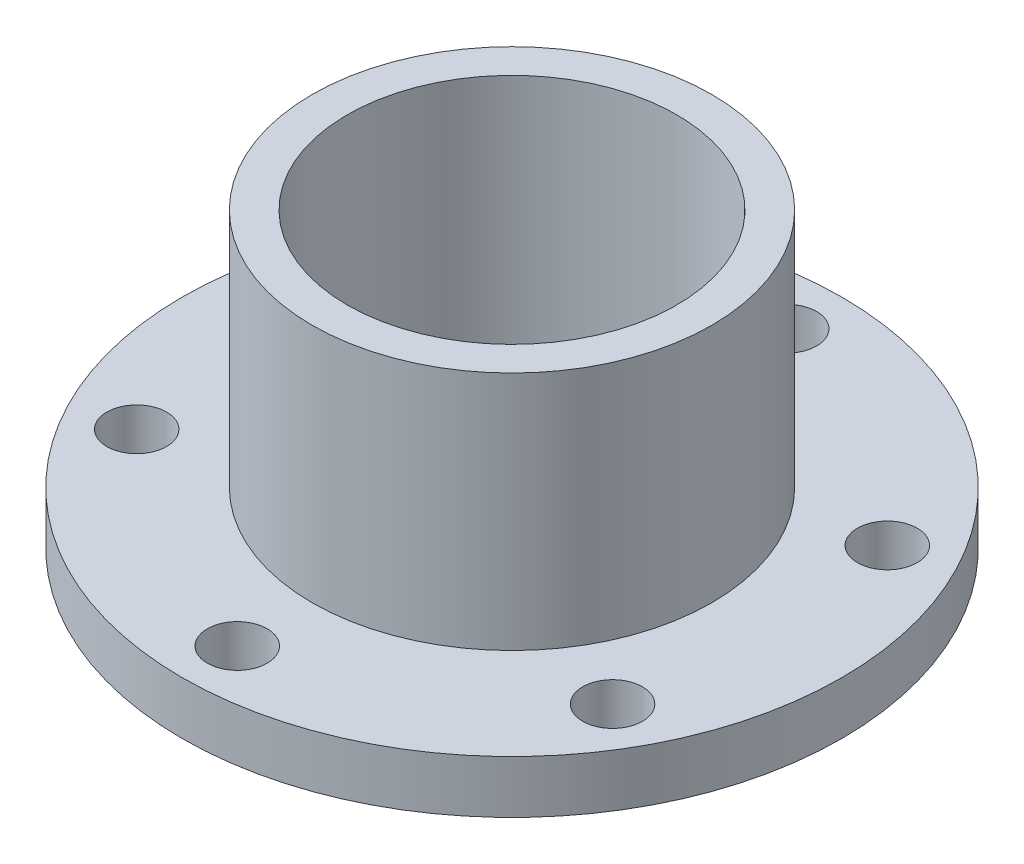
ISO-10303-21;
HEADER;
FILE_DESCRIPTION(('STEP AP214'),'2;1');
FILE_NAME('part.step','',(''),(''),'','','');
FILE_SCHEMA(('AUTOMOTIVE_DESIGN { 1 0 10303 214 1 1 1 1 }'));
ENDSEC;
DATA;
#1=APPLICATION_CONTEXT('core data for automotive mechanical design processes');
#2=APPLICATION_PROTOCOL_DEFINITION('international standard','automotive_design',2000,#1);
#3=PRODUCT_CONTEXT('',#1,'mechanical');
#4=PRODUCT('Part','Part','',(#3));
#5=PRODUCT_RELATED_PRODUCT_CATEGORY('part','',(#4));
#6=PRODUCT_DEFINITION_FORMATION('','',#4);
#7=PRODUCT_DEFINITION_CONTEXT('part definition',#1,'design');
#8=PRODUCT_DEFINITION('design','',#6,#7);
#9=PRODUCT_DEFINITION_SHAPE('','',#8);
#10=(LENGTH_UNIT() NAMED_UNIT(*) SI_UNIT(.MILLI.,.METRE.));
#11=(NAMED_UNIT(*) PLANE_ANGLE_UNIT() SI_UNIT($,.RADIAN.));
#12=(NAMED_UNIT(*) SI_UNIT($,.STERADIAN.) SOLID_ANGLE_UNIT());
#13=UNCERTAINTY_MEASURE_WITH_UNIT(LENGTH_MEASURE(1.E-05),#10,'distance_accuracy_value','');
#14=(GEOMETRIC_REPRESENTATION_CONTEXT(3) GLOBAL_UNCERTAINTY_ASSIGNED_CONTEXT((#13)) GLOBAL_UNIT_ASSIGNED_CONTEXT((#10,
#11,#12)) REPRESENTATION_CONTEXT('',''));
#15=CARTESIAN_POINT('',(0.,0.,0.));
#16=DIRECTION('',(0.,0.,1.));
#17=DIRECTION('',(1.,0.,0.));
#18=AXIS2_PLACEMENT_3D('',#15,#16,#17);
#19=CARTESIAN_POINT('',(0.,0.,0.));
#20=DIRECTION('',(0.,-1.,0.));
#21=DIRECTION('',(0.,0.,-1.));
#22=AXIS2_PLACEMENT_3D('',#19,#20,#21);
#23=CYLINDRICAL_SURFACE('',#22,17.3228);
#24=CARTESIAN_POINT('',(0.,25.4,0.));
#25=DIRECTION('',(0.,-1.,0.));
#26=DIRECTION('',(0.,0.,-1.));
#27=AXIS2_PLACEMENT_3D('',#24,#25,#26);
#28=CIRCLE('',#27,17.3228);
#29=CARTESIAN_POINT('',(0.,25.4,-17.3228));
#30=VERTEX_POINT('',#29);
#31=EDGE_CURVE('E18',#30,#30,#28,.F.);
#32=ORIENTED_EDGE('',*,*,#31,.F.);
#33=EDGE_LOOP('',(#32));
#34=FACE_BOUND('',#33,.T.);
#35=CARTESIAN_POINT('',(0.,4.572,0.));
#36=DIRECTION('',(0.,-1.,0.));
#37=DIRECTION('',(0.,0.,-1.));
#38=AXIS2_PLACEMENT_3D('',#35,#36,#37);
#39=CIRCLE('',#38,17.3228);
#40=CARTESIAN_POINT('',(0.,4.572,-17.3228));
#41=VERTEX_POINT('',#40);
#42=EDGE_CURVE('E70',#41,#41,#39,.T.);
#43=ORIENTED_EDGE('',*,*,#42,.F.);
#44=EDGE_LOOP('',(#43));
#45=FACE_BOUND('',#44,.T.);
#46=ADVANCED_FACE('F15',(#34,#45),#23,.T.);
#47=CARTESIAN_POINT('',(0.,25.4,0.));
#48=DIRECTION('',(0.,1.,0.));
#49=DIRECTION('',(0.,0.,1.));
#50=AXIS2_PLACEMENT_3D('',#47,#48,#49);
#51=PLANE('',#50);
#52=ORIENTED_EDGE('',*,*,#31,.T.);
#53=EDGE_LOOP('',(#52));
#54=FACE_BOUND('',#53,.T.);
#55=CARTESIAN_POINT('',(0.,25.4,0.));
#56=DIRECTION('',(0.,1.,0.));
#57=DIRECTION('',(0.,0.,1.));
#58=AXIS2_PLACEMENT_3D('',#55,#56,#57);
#59=CIRCLE('',#58,14.28115);
#60=CARTESIAN_POINT('',(0.,25.4,14.28115));
#61=VERTEX_POINT('',#60);
#62=EDGE_CURVE('E50',#61,#61,#59,.F.);
#63=ORIENTED_EDGE('',*,*,#62,.T.);
#64=EDGE_LOOP('',(#63));
#65=FACE_BOUND('',#64,.T.);
#66=ADVANCED_FACE('F77',(#54,#65),#51,.T.);
#67=CARTESIAN_POINT('',(28.575,4.572,0.));
#68=DIRECTION('',(0.,1.,0.));
#69=DIRECTION('',(0.,0.,1.));
#70=AXIS2_PLACEMENT_3D('',#67,#68,#69);
#71=PLANE('',#70);
#72=CARTESIAN_POINT('',(0.,4.572,0.));
#73=DIRECTION('',(0.,-1.,0.));
#74=DIRECTION('',(0.,0.,-1.));
#75=AXIS2_PLACEMENT_3D('',#72,#73,#74);
#76=CIRCLE('',#75,28.575);
#77=CARTESIAN_POINT('',(0.,4.572,-28.575));
#78=VERTEX_POINT('',#77);
#79=EDGE_CURVE('E47',#78,#78,#76,.T.);
#80=ORIENTED_EDGE('',*,*,#79,.F.);
#81=EDGE_LOOP('',(#80));
#82=FACE_BOUND('',#81,.T.);
#83=ORIENTED_EDGE('',*,*,#42,.T.);
#84=EDGE_LOOP('',(#83));
#85=FACE_BOUND('',#84,.T.);
#86=CARTESIAN_POINT('',(0.,4.572,23.8125));
#87=DIRECTION('',(0.,1.,0.));
#88=DIRECTION('',(0.,0.,1.));
#89=AXIS2_PLACEMENT_3D('',#86,#87,#88);
#90=CIRCLE('',#89,2.5908);
#91=CARTESIAN_POINT('',(0.,4.572,26.4033));
#92=VERTEX_POINT('',#91);
#93=EDGE_CURVE('E53',#92,#92,#90,.F.);
#94=ORIENTED_EDGE('',*,*,#93,.T.);
#95=EDGE_LOOP('',(#94));
#96=FACE_BOUND('',#95,.T.);
#97=CARTESIAN_POINT('',(-20.622229927617,4.572,11.90625));
#98=DIRECTION('',(0.,1.,0.));
#99=DIRECTION('',(0.,0.,1.));
#100=AXIS2_PLACEMENT_3D('',#97,#98,#99);
#101=CIRCLE('',#100,2.5908);
#102=CARTESIAN_POINT('',(-20.622229927617,4.572,14.49705));
#103=VERTEX_POINT('',#102);
#104=EDGE_CURVE('E56',#103,#103,#101,.F.);
#105=ORIENTED_EDGE('',*,*,#104,.T.);
#106=EDGE_LOOP('',(#105));
#107=FACE_BOUND('',#106,.T.);
#108=CARTESIAN_POINT('',(-20.6222299276169,4.572,-11.9062500000001));
#109=DIRECTION('',(0.,1.,0.));
#110=DIRECTION('',(0.,0.,1.));
#111=AXIS2_PLACEMENT_3D('',#108,#109,#110);
#112=CIRCLE('',#111,2.5908);
#113=CARTESIAN_POINT('',(-20.6222299276169,4.572,-9.3154500000001));
#114=VERTEX_POINT('',#113);
#115=EDGE_CURVE('E59',#114,#114,#112,.F.);
#116=ORIENTED_EDGE('',*,*,#115,.T.);
#117=EDGE_LOOP('',(#116));
#118=FACE_BOUND('',#117,.T.);
#119=CARTESIAN_POINT('',(1.66281798762404E-13,4.572,-23.8125));
#120=DIRECTION('',(0.,1.,0.));
#121=DIRECTION('',(0.,0.,1.));
#122=AXIS2_PLACEMENT_3D('',#119,#120,#121);
#123=CIRCLE('',#122,2.5908);
#124=CARTESIAN_POINT('',(1.66281798762404E-13,4.572,-21.2217));
#125=VERTEX_POINT('',#124);
#126=EDGE_CURVE('E62',#125,#125,#123,.F.);
#127=ORIENTED_EDGE('',*,*,#126,.T.);
#128=EDGE_LOOP('',(#127));
#129=FACE_BOUND('',#128,.T.);
#130=CARTESIAN_POINT('',(20.6222299276171,4.572,-11.9062499999998));
#131=DIRECTION('',(0.,1.,0.));
#132=DIRECTION('',(0.,0.,1.));
#133=AXIS2_PLACEMENT_3D('',#130,#131,#132);
#134=CIRCLE('',#133,2.5908);
#135=CARTESIAN_POINT('',(20.6222299276171,4.572,-9.31544999999981));
#136=VERTEX_POINT('',#135);
#137=EDGE_CURVE('E65',#136,#136,#134,.F.);
#138=ORIENTED_EDGE('',*,*,#137,.T.);
#139=EDGE_LOOP('',(#138));
#140=FACE_BOUND('',#139,.T.);
#141=CARTESIAN_POINT('',(20.6222299276168,4.572,11.9062500000002));
#142=DIRECTION('',(0.,1.,0.));
#143=DIRECTION('',(0.,0.,1.));
#144=AXIS2_PLACEMENT_3D('',#141,#142,#143);
#145=CIRCLE('',#144,2.5908);
#146=CARTESIAN_POINT('',(20.6222299276168,4.572,14.4970500000002));
#147=VERTEX_POINT('',#146);
#148=EDGE_CURVE('E68',#147,#147,#145,.F.);
#149=ORIENTED_EDGE('',*,*,#148,.T.);
#150=EDGE_LOOP('',(#149));
#151=FACE_BOUND('',#150,.T.);
#152=ADVANCED_FACE('F86',(#82,#85,#96,#107,#118,#129,#140,#151),#71,.T.);
#153=CARTESIAN_POINT('',(20.6222299276168,0.,11.9062500000002));
#154=DIRECTION('',(0.,1.,0.));
#155=DIRECTION('',(0.,0.,1.));
#156=AXIS2_PLACEMENT_3D('',#153,#154,#155);
#157=CYLINDRICAL_SURFACE('',#156,2.5908);
#158=ORIENTED_EDGE('',*,*,#148,.F.);
#159=EDGE_LOOP('',(#158));
#160=FACE_BOUND('',#159,.T.);
#161=CARTESIAN_POINT('',(20.6222299276168,0.,11.9062500000002));
#162=DIRECTION('',(0.,1.,0.));
#163=DIRECTION('',(0.,0.,1.));
#164=AXIS2_PLACEMENT_3D('',#161,#162,#163);
#165=CIRCLE('',#164,2.5908);
#166=CARTESIAN_POINT('',(20.6222299276168,0.,14.4970500000002));
#167=VERTEX_POINT('',#166);
#168=EDGE_CURVE('E44',#167,#167,#165,.T.);
#169=ORIENTED_EDGE('',*,*,#168,.F.);
#170=EDGE_LOOP('',(#169));
#171=FACE_BOUND('',#170,.T.);
#172=ADVANCED_FACE('F121',(#160,#171),#157,.F.);
#173=CARTESIAN_POINT('',(20.6222299276171,0.,-11.9062499999998));
#174=DIRECTION('',(0.,1.,0.));
#175=DIRECTION('',(0.,0.,1.));
#176=AXIS2_PLACEMENT_3D('',#173,#174,#175);
#177=CYLINDRICAL_SURFACE('',#176,2.5908);
#178=ORIENTED_EDGE('',*,*,#137,.F.);
#179=EDGE_LOOP('',(#178));
#180=FACE_BOUND('',#179,.T.);
#181=CARTESIAN_POINT('',(20.6222299276171,0.,-11.9062499999998));
#182=DIRECTION('',(0.,1.,0.));
#183=DIRECTION('',(0.,0.,1.));
#184=AXIS2_PLACEMENT_3D('',#181,#182,#183);
#185=CIRCLE('',#184,2.5908);
#186=CARTESIAN_POINT('',(20.6222299276171,0.,-9.31544999999981));
#187=VERTEX_POINT('',#186);
#188=EDGE_CURVE('E41',#187,#187,#185,.T.);
#189=ORIENTED_EDGE('',*,*,#188,.F.);
#190=EDGE_LOOP('',(#189));
#191=FACE_BOUND('',#190,.T.);
#192=ADVANCED_FACE('F117',(#180,#191),#177,.F.);
#193=CARTESIAN_POINT('',(1.66281798762404E-13,0.,-23.8125));
#194=DIRECTION('',(0.,1.,0.));
#195=DIRECTION('',(0.,0.,1.));
#196=AXIS2_PLACEMENT_3D('',#193,#194,#195);
#197=CYLINDRICAL_SURFACE('',#196,2.5908);
#198=ORIENTED_EDGE('',*,*,#126,.F.);
#199=EDGE_LOOP('',(#198));
#200=FACE_BOUND('',#199,.T.);
#201=CARTESIAN_POINT('',(1.66281798762404E-13,0.,-23.8125));
#202=DIRECTION('',(0.,1.,0.));
#203=DIRECTION('',(0.,0.,1.));
#204=AXIS2_PLACEMENT_3D('',#201,#202,#203);
#205=CIRCLE('',#204,2.5908);
#206=CARTESIAN_POINT('',(1.66281798762404E-13,0.,-21.2217));
#207=VERTEX_POINT('',#206);
#208=EDGE_CURVE('E38',#207,#207,#205,.T.);
#209=ORIENTED_EDGE('',*,*,#208,.F.);
#210=EDGE_LOOP('',(#209));
#211=FACE_BOUND('',#210,.T.);
#212=ADVANCED_FACE('F113',(#200,#211),#197,.F.);
#213=CARTESIAN_POINT('',(-20.6222299276169,0.,-11.9062500000001));
#214=DIRECTION('',(0.,1.,0.));
#215=DIRECTION('',(0.,0.,1.));
#216=AXIS2_PLACEMENT_3D('',#213,#214,#215);
#217=CYLINDRICAL_SURFACE('',#216,2.5908);
#218=ORIENTED_EDGE('',*,*,#115,.F.);
#219=EDGE_LOOP('',(#218));
#220=FACE_BOUND('',#219,.T.);
#221=CARTESIAN_POINT('',(-20.6222299276169,0.,-11.9062500000001));
#222=DIRECTION('',(0.,1.,0.));
#223=DIRECTION('',(0.,0.,1.));
#224=AXIS2_PLACEMENT_3D('',#221,#222,#223);
#225=CIRCLE('',#224,2.5908);
#226=CARTESIAN_POINT('',(-20.6222299276169,0.,-9.3154500000001));
#227=VERTEX_POINT('',#226);
#228=EDGE_CURVE('E35',#227,#227,#225,.T.);
#229=ORIENTED_EDGE('',*,*,#228,.F.);
#230=EDGE_LOOP('',(#229));
#231=FACE_BOUND('',#230,.T.);
#232=ADVANCED_FACE('F109',(#220,#231),#217,.F.);
#233=CARTESIAN_POINT('',(-20.622229927617,0.,11.90625));
#234=DIRECTION('',(0.,1.,0.));
#235=DIRECTION('',(0.,0.,1.));
#236=AXIS2_PLACEMENT_3D('',#233,#234,#235);
#237=CYLINDRICAL_SURFACE('',#236,2.5908);
#238=ORIENTED_EDGE('',*,*,#104,.F.);
#239=EDGE_LOOP('',(#238));
#240=FACE_BOUND('',#239,.T.);
#241=CARTESIAN_POINT('',(-20.622229927617,0.,11.90625));
#242=DIRECTION('',(0.,1.,0.));
#243=DIRECTION('',(0.,0.,1.));
#244=AXIS2_PLACEMENT_3D('',#241,#242,#243);
#245=CIRCLE('',#244,2.5908);
#246=CARTESIAN_POINT('',(-20.622229927617,0.,14.49705));
#247=VERTEX_POINT('',#246);
#248=EDGE_CURVE('E32',#247,#247,#245,.T.);
#249=ORIENTED_EDGE('',*,*,#248,.F.);
#250=EDGE_LOOP('',(#249));
#251=FACE_BOUND('',#250,.T.);
#252=ADVANCED_FACE('F105',(#240,#251),#237,.F.);
#253=CARTESIAN_POINT('',(0.,0.,23.8125));
#254=DIRECTION('',(0.,1.,0.));
#255=DIRECTION('',(0.,0.,1.));
#256=AXIS2_PLACEMENT_3D('',#253,#254,#255);
#257=CYLINDRICAL_SURFACE('',#256,2.5908);
#258=ORIENTED_EDGE('',*,*,#93,.F.);
#259=EDGE_LOOP('',(#258));
#260=FACE_BOUND('',#259,.T.);
#261=CARTESIAN_POINT('',(0.,0.,23.8125));
#262=DIRECTION('',(0.,1.,0.));
#263=DIRECTION('',(0.,0.,1.));
#264=AXIS2_PLACEMENT_3D('',#261,#262,#263);
#265=CIRCLE('',#264,2.5908);
#266=CARTESIAN_POINT('',(0.,0.,26.4033));
#267=VERTEX_POINT('',#266);
#268=EDGE_CURVE('E27',#267,#267,#265,.T.);
#269=ORIENTED_EDGE('',*,*,#268,.F.);
#270=EDGE_LOOP('',(#269));
#271=FACE_BOUND('',#270,.T.);
#272=ADVANCED_FACE('F101',(#260,#271),#257,.F.);
#273=CARTESIAN_POINT('',(0.,0.,0.));
#274=DIRECTION('',(0.,1.,0.));
#275=DIRECTION('',(0.,0.,1.));
#276=AXIS2_PLACEMENT_3D('',#273,#274,#275);
#277=CYLINDRICAL_SURFACE('',#276,14.28115);
#278=ORIENTED_EDGE('',*,*,#62,.F.);
#279=EDGE_LOOP('',(#278));
#280=FACE_BOUND('',#279,.T.);
#281=CARTESIAN_POINT('',(0.,0.,0.));
#282=DIRECTION('',(0.,1.,0.));
#283=DIRECTION('',(0.,0.,1.));
#284=AXIS2_PLACEMENT_3D('',#281,#282,#283);
#285=CIRCLE('',#284,14.28115);
#286=CARTESIAN_POINT('',(0.,0.,14.28115));
#287=VERTEX_POINT('',#286);
#288=EDGE_CURVE('E22',#287,#287,#285,.T.);
#289=ORIENTED_EDGE('',*,*,#288,.F.);
#290=EDGE_LOOP('',(#289));
#291=FACE_BOUND('',#290,.T.);
#292=ADVANCED_FACE('F94',(#280,#291),#277,.F.);
#293=CARTESIAN_POINT('',(0.,0.,0.));
#294=DIRECTION('',(0.,-1.,0.));
#295=DIRECTION('',(0.,0.,-1.));
#296=AXIS2_PLACEMENT_3D('',#293,#294,#295);
#297=CYLINDRICAL_SURFACE('',#296,28.575);
#298=ORIENTED_EDGE('',*,*,#79,.T.);
#299=EDGE_LOOP('',(#298));
#300=FACE_BOUND('',#299,.T.);
#301=CARTESIAN_POINT('',(0.,0.,0.));
#302=DIRECTION('',(0.,-1.,0.));
#303=DIRECTION('',(0.,0.,-1.));
#304=AXIS2_PLACEMENT_3D('',#301,#302,#303);
#305=CIRCLE('',#304,28.575);
#306=CARTESIAN_POINT('',(0.,0.,-28.575));
#307=VERTEX_POINT('',#306);
#308=EDGE_CURVE('E10',#307,#307,#305,.T.);
#309=ORIENTED_EDGE('',*,*,#308,.F.);
#310=EDGE_LOOP('',(#309));
#311=FACE_BOUND('',#310,.T.);
#312=ADVANCED_FACE('F89',(#300,#311),#297,.T.);
#313=CARTESIAN_POINT('',(0.,0.,0.));
#314=DIRECTION('',(0.,-1.,0.));
#315=DIRECTION('',(0.,0.,-1.));
#316=AXIS2_PLACEMENT_3D('',#313,#314,#315);
#317=PLANE('',#316);
#318=ORIENTED_EDGE('',*,*,#308,.T.);
#319=EDGE_LOOP('',(#318));
#320=FACE_BOUND('',#319,.T.);
#321=ORIENTED_EDGE('',*,*,#288,.T.);
#322=EDGE_LOOP('',(#321));
#323=FACE_BOUND('',#322,.T.);
#324=ORIENTED_EDGE('',*,*,#268,.T.);
#325=EDGE_LOOP('',(#324));
#326=FACE_BOUND('',#325,.T.);
#327=ORIENTED_EDGE('',*,*,#248,.T.);
#328=EDGE_LOOP('',(#327));
#329=FACE_BOUND('',#328,.T.);
#330=ORIENTED_EDGE('',*,*,#228,.T.);
#331=EDGE_LOOP('',(#330));
#332=FACE_BOUND('',#331,.T.);
#333=ORIENTED_EDGE('',*,*,#208,.T.);
#334=EDGE_LOOP('',(#333));
#335=FACE_BOUND('',#334,.T.);
#336=ORIENTED_EDGE('',*,*,#188,.T.);
#337=EDGE_LOOP('',(#336));
#338=FACE_BOUND('',#337,.T.);
#339=ORIENTED_EDGE('',*,*,#168,.T.);
#340=EDGE_LOOP('',(#339));
#341=FACE_BOUND('',#340,.T.);
#342=ADVANCED_FACE('F87',(#320,#323,#326,#329,#332,#335,#338,#341),#317,.T.);
#343=CLOSED_SHELL('',(#46,#66,#152,#172,#192,#212,#232,#252,#272,#292,#312,#342));
#344=MANIFOLD_SOLID_BREP('B1',#343);
#345=ADVANCED_BREP_SHAPE_REPRESENTATION('',(#18,#344),#14);
#346=SHAPE_DEFINITION_REPRESENTATION(#9,#345);
ENDSEC;
END-ISO-10303-21;
